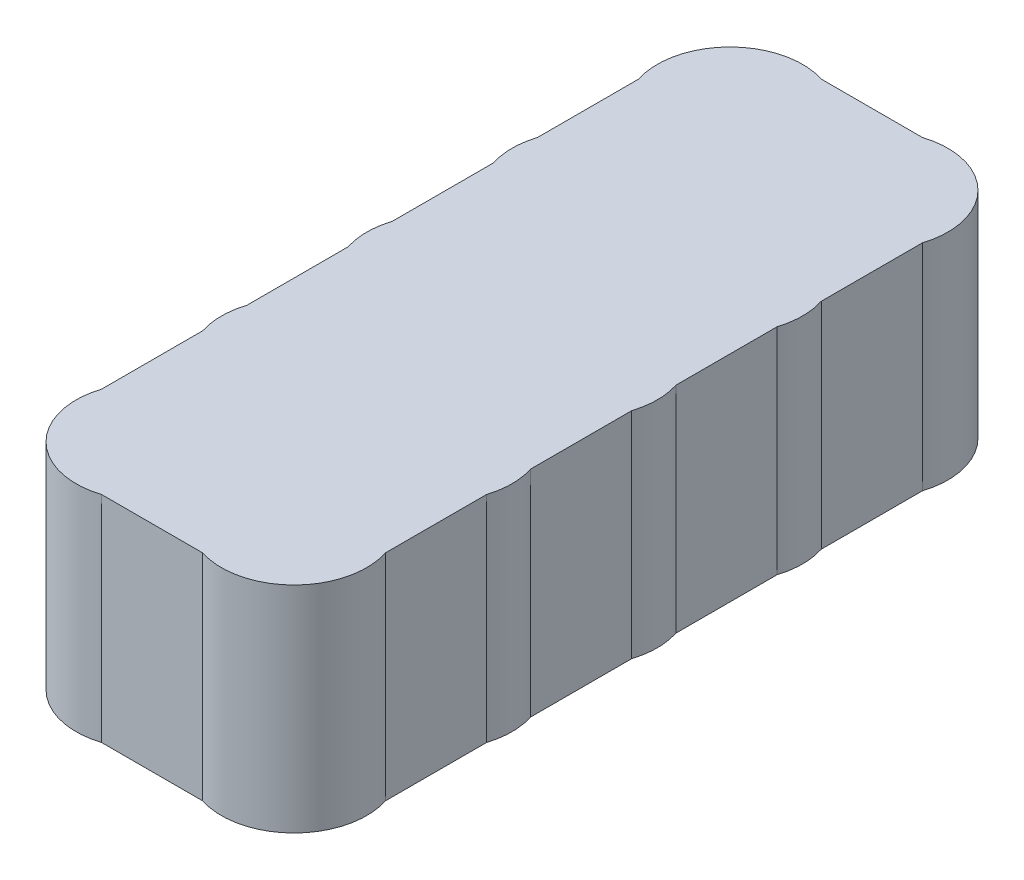
ISO-10303-21;
HEADER;
FILE_DESCRIPTION(('STEP AP214'),'2;1');
FILE_NAME('part.step','',(''),(''),'','','');
FILE_SCHEMA(('AUTOMOTIVE_DESIGN { 1 0 10303 214 1 1 1 1 }'));
ENDSEC;
DATA;
#1=APPLICATION_CONTEXT('core data for automotive mechanical design processes');
#2=APPLICATION_PROTOCOL_DEFINITION('international standard','automotive_design',2000,#1);
#3=PRODUCT_CONTEXT('',#1,'mechanical');
#4=PRODUCT('Part','Part','',(#3));
#5=PRODUCT_RELATED_PRODUCT_CATEGORY('part','',(#4));
#6=PRODUCT_DEFINITION_FORMATION('','',#4);
#7=PRODUCT_DEFINITION_CONTEXT('part definition',#1,'design');
#8=PRODUCT_DEFINITION('design','',#6,#7);
#9=PRODUCT_DEFINITION_SHAPE('','',#8);
#10=(LENGTH_UNIT() NAMED_UNIT(*) SI_UNIT(.MILLI.,.METRE.));
#11=(NAMED_UNIT(*) PLANE_ANGLE_UNIT() SI_UNIT($,.RADIAN.));
#12=(NAMED_UNIT(*) SI_UNIT($,.STERADIAN.) SOLID_ANGLE_UNIT());
#13=UNCERTAINTY_MEASURE_WITH_UNIT(LENGTH_MEASURE(1.E-05),#10,'distance_accuracy_value','');
#14=(GEOMETRIC_REPRESENTATION_CONTEXT(3) GLOBAL_UNCERTAINTY_ASSIGNED_CONTEXT((#13)) GLOBAL_UNIT_ASSIGNED_CONTEXT((#10,
#11,#12)) REPRESENTATION_CONTEXT('',''));
#15=CARTESIAN_POINT('',(0.,0.,0.));
#16=DIRECTION('',(0.,0.,1.));
#17=DIRECTION('',(1.,0.,0.));
#18=AXIS2_PLACEMENT_3D('',#15,#16,#17);
#19=CARTESIAN_POINT('',(22.9999999999998,34.,-46.));
#20=DIRECTION('',(0.,-1.,0.));
#21=DIRECTION('',(0.,0.,-1.));
#22=AXIS2_PLACEMENT_3D('',#19,#20,#21);
#23=CYLINDRICAL_SURFACE('',#22,11.5);
#24=CARTESIAN_POINT('',(22.9999999999998,34.,-46.));
#25=DIRECTION('',(0.,1.,0.));
#26=DIRECTION('',(0.,0.,1.));
#27=AXIS2_PLACEMENT_3D('',#24,#25,#26);
#28=CIRCLE('',#27,11.5);
#29=CARTESIAN_POINT('',(33.954451150103,34.,-42.4999999999995));
#30=VERTEX_POINT('',#29);
#31=CARTESIAN_POINT('',(33.954451150103,34.,-49.5000000000005));
#32=VERTEX_POINT('',#31);
#33=EDGE_CURVE('E332',#30,#32,#28,.T.);
#34=ORIENTED_EDGE('',*,*,#33,.F.);
#35=DIRECTION('',(0.,-1.,0.));
#36=VECTOR('',#35,1.);
#37=CARTESIAN_POINT('',(33.954451150103,34.,-42.4999999999995));
#38=LINE('',#37,#36);
#39=CARTESIAN_POINT('',(33.954451150103,0.,-42.4999999999995));
#40=VERTEX_POINT('',#39);
#41=EDGE_CURVE('E328',#30,#40,#38,.T.);
#42=ORIENTED_EDGE('',*,*,#41,.T.);
#43=CARTESIAN_POINT('',(22.9999999999998,0.,-46.));
#44=DIRECTION('',(0.,1.,0.));
#45=DIRECTION('',(0.,0.,1.));
#46=AXIS2_PLACEMENT_3D('',#43,#44,#45);
#47=CIRCLE('',#46,11.5);
#48=CARTESIAN_POINT('',(33.954451150103,0.,-49.5000000000005));
#49=VERTEX_POINT('',#48);
#50=EDGE_CURVE('E331',#40,#49,#47,.T.);
#51=ORIENTED_EDGE('',*,*,#50,.T.);
#52=DIRECTION('',(0.,-1.,0.));
#53=VECTOR('',#52,1.);
#54=CARTESIAN_POINT('',(33.954451150103,34.,-49.5000000000005));
#55=LINE('',#54,#53);
#56=EDGE_CURVE('E325',#49,#32,#55,.F.);
#57=ORIENTED_EDGE('',*,*,#56,.T.);
#58=EDGE_LOOP('',(#34,#42,#51,#57));
#59=FACE_BOUND('',#58,.T.);
#60=ADVANCED_FACE('F45',(#59),#23,.T.);
#61=CARTESIAN_POINT('',(22.9999999999998,34.,-69.));
#62=DIRECTION('',(0.,-1.,0.));
#63=DIRECTION('',(0.,0.,-1.));
#64=AXIS2_PLACEMENT_3D('',#61,#62,#63);
#65=CYLINDRICAL_SURFACE('',#64,11.5);
#66=CARTESIAN_POINT('',(22.9999999999998,34.,-69.));
#67=DIRECTION('',(0.,1.,0.));
#68=DIRECTION('',(0.,0.,1.));
#69=AXIS2_PLACEMENT_3D('',#66,#67,#68);
#70=CIRCLE('',#69,11.5);
#71=CARTESIAN_POINT('',(33.954451150103,34.,-65.4999999999998));
#72=VERTEX_POINT('',#71);
#73=CARTESIAN_POINT('',(33.954451150103,34.,-72.5000000000003));
#74=VERTEX_POINT('',#73);
#75=EDGE_CURVE('E336',#72,#74,#70,.T.);
#76=ORIENTED_EDGE('',*,*,#75,.F.);
#77=DIRECTION('',(0.,-1.,0.));
#78=VECTOR('',#77,1.);
#79=CARTESIAN_POINT('',(33.954451150103,34.,-65.4999999999998));
#80=LINE('',#79,#78);
#81=CARTESIAN_POINT('',(33.954451150103,0.,-65.4999999999998));
#82=VERTEX_POINT('',#81);
#83=EDGE_CURVE('E321',#72,#82,#80,.T.);
#84=ORIENTED_EDGE('',*,*,#83,.T.);
#85=CARTESIAN_POINT('',(22.9999999999998,0.,-69.));
#86=DIRECTION('',(0.,1.,0.));
#87=DIRECTION('',(0.,0.,1.));
#88=AXIS2_PLACEMENT_3D('',#85,#86,#87);
#89=CIRCLE('',#88,11.5);
#90=CARTESIAN_POINT('',(33.954451150103,0.,-72.5000000000003));
#91=VERTEX_POINT('',#90);
#92=EDGE_CURVE('E358',#82,#91,#89,.T.);
#93=ORIENTED_EDGE('',*,*,#92,.T.);
#94=DIRECTION('',(0.,-1.,0.));
#95=VECTOR('',#94,1.);
#96=CARTESIAN_POINT('',(33.954451150103,34.,-72.5000000000003));
#97=LINE('',#96,#95);
#98=EDGE_CURVE('E318',#91,#74,#97,.F.);
#99=ORIENTED_EDGE('',*,*,#98,.T.);
#100=EDGE_LOOP('',(#76,#84,#93,#99));
#101=FACE_BOUND('',#100,.T.);
#102=ADVANCED_FACE('F442',(#101),#65,.T.);
#103=CARTESIAN_POINT('',(22.9999999999997,34.,-92.));
#104=DIRECTION('',(0.,-1.,0.));
#105=DIRECTION('',(0.,0.,-1.));
#106=AXIS2_PLACEMENT_3D('',#103,#104,#105);
#107=CYLINDRICAL_SURFACE('',#106,11.5);
#108=CARTESIAN_POINT('',(22.9999999999997,0.,-92.));
#109=DIRECTION('',(0.,1.,0.));
#110=DIRECTION('',(0.,0.,1.));
#111=AXIS2_PLACEMENT_3D('',#108,#109,#110);
#112=CIRCLE('',#111,11.5);
#113=CARTESIAN_POINT('',(33.954451150103,0.,-88.5));
#114=VERTEX_POINT('',#113);
#115=CARTESIAN_POINT('',(19.4999999999997,0.,-102.954451150103));
#116=VERTEX_POINT('',#115);
#117=EDGE_CURVE('E361',#114,#116,#112,.T.);
#118=ORIENTED_EDGE('',*,*,#117,.T.);
#119=DIRECTION('',(0.,1.,0.));
#120=VECTOR('',#119,1.);
#121=CARTESIAN_POINT('',(19.4999999999997,-122.442017008246,-102.954451150103));
#122=LINE('',#121,#120);
#123=CARTESIAN_POINT('',(19.4999999999997,34.,-102.954451150103));
#124=VERTEX_POINT('',#123);
#125=EDGE_CURVE('E265',#116,#124,#122,.T.);
#126=ORIENTED_EDGE('',*,*,#125,.T.);
#127=CARTESIAN_POINT('',(22.9999999999997,34.,-92.));
#128=DIRECTION('',(0.,1.,0.));
#129=DIRECTION('',(0.,0.,1.));
#130=AXIS2_PLACEMENT_3D('',#127,#128,#129);
#131=CIRCLE('',#130,11.5);
#132=CARTESIAN_POINT('',(33.954451150103,34.,-88.5));
#133=VERTEX_POINT('',#132);
#134=EDGE_CURVE('E294',#133,#124,#131,.T.);
#135=ORIENTED_EDGE('',*,*,#134,.F.);
#136=DIRECTION('',(0.,1.,0.));
#137=VECTOR('',#136,1.);
#138=CARTESIAN_POINT('',(33.954451150103,-122.442017008246,-88.5));
#139=LINE('',#138,#137);
#140=EDGE_CURVE('E268',#114,#133,#139,.T.);
#141=ORIENTED_EDGE('',*,*,#140,.F.);
#142=EDGE_LOOP('',(#118,#126,#135,#141));
#143=FACE_BOUND('',#142,.T.);
#144=ADVANCED_FACE('F447',(#143),#107,.T.);
#145=CARTESIAN_POINT('',(-3.15582907897491E-13,34.,-92.));
#146=DIRECTION('',(0.,-1.,0.));
#147=DIRECTION('',(0.,0.,-1.));
#148=AXIS2_PLACEMENT_3D('',#145,#146,#147);
#149=CYLINDRICAL_SURFACE('',#148,11.5);
#150=CARTESIAN_POINT('',(-3.15582907897491E-13,34.,-92.));
#151=DIRECTION('',(0.,1.,0.));
#152=DIRECTION('',(0.,0.,1.));
#153=AXIS2_PLACEMENT_3D('',#150,#151,#152);
#154=CIRCLE('',#153,11.5);
#155=CARTESIAN_POINT('',(3.49999999999969,34.,-102.954451150103));
#156=VERTEX_POINT('',#155);
#157=CARTESIAN_POINT('',(-10.9544511501036,34.,-88.4999999999999));
#158=VERTEX_POINT('',#157);
#159=EDGE_CURVE('E282',#156,#158,#154,.T.);
#160=ORIENTED_EDGE('',*,*,#159,.F.);
#161=DIRECTION('',(0.,1.,0.));
#162=VECTOR('',#161,1.);
#163=CARTESIAN_POINT('',(3.4999999999997,-122.442017008246,-102.954451150103));
#164=LINE('',#163,#162);
#165=CARTESIAN_POINT('',(3.4999999999997,0.,-102.954451150103));
#166=VERTEX_POINT('',#165);
#167=EDGE_CURVE('E261',#166,#156,#164,.T.);
#168=ORIENTED_EDGE('',*,*,#167,.F.);
#169=CARTESIAN_POINT('',(-3.15582907897491E-13,0.,-92.));
#170=DIRECTION('',(0.,1.,0.));
#171=DIRECTION('',(0.,0.,1.));
#172=AXIS2_PLACEMENT_3D('',#169,#170,#171);
#173=CIRCLE('',#172,11.5);
#174=CARTESIAN_POINT('',(-10.9544511501036,0.,-88.4999999999999));
#175=VERTEX_POINT('',#174);
#176=EDGE_CURVE('E283',#166,#175,#173,.T.);
#177=ORIENTED_EDGE('',*,*,#176,.T.);
#178=DIRECTION('',(0.,1.,0.));
#179=VECTOR('',#178,1.);
#180=CARTESIAN_POINT('',(-10.9544511501036,-122.442017008246,-88.4999999999998));
#181=LINE('',#180,#179);
#182=EDGE_CURVE('E205',#175,#158,#181,.T.);
#183=ORIENTED_EDGE('',*,*,#182,.T.);
#184=EDGE_LOOP('',(#160,#168,#177,#183));
#185=FACE_BOUND('',#184,.T.);
#186=ADVANCED_FACE('F280',(#185),#149,.T.);
#187=CARTESIAN_POINT('',(-2.36687180923118E-13,34.,-69.));
#188=DIRECTION('',(0.,-1.,0.));
#189=DIRECTION('',(0.,0.,-1.));
#190=AXIS2_PLACEMENT_3D('',#187,#188,#189);
#191=CYLINDRICAL_SURFACE('',#190,11.5);
#192=CARTESIAN_POINT('',(-2.36687180923118E-13,34.,-69.));
#193=DIRECTION('',(0.,1.,0.));
#194=DIRECTION('',(0.,0.,1.));
#195=AXIS2_PLACEMENT_3D('',#192,#193,#194);
#196=CIRCLE('',#195,11.5);
#197=CARTESIAN_POINT('',(-10.9544511501036,34.,-72.4999999999998));
#198=VERTEX_POINT('',#197);
#199=CARTESIAN_POINT('',(-10.9544511501036,34.,-65.5000000000002));
#200=VERTEX_POINT('',#199);
#201=EDGE_CURVE('E293',#198,#200,#196,.T.);
#202=ORIENTED_EDGE('',*,*,#201,.F.);
#203=DIRECTION('',(0.,-1.,0.));
#204=VECTOR('',#203,1.);
#205=CARTESIAN_POINT('',(-10.9544511501036,34.,-72.4999999999998));
#206=LINE('',#205,#204);
#207=CARTESIAN_POINT('',(-10.9544511501036,0.,-72.4999999999998));
#208=VERTEX_POINT('',#207);
#209=EDGE_CURVE('E299',#198,#208,#206,.T.);
#210=ORIENTED_EDGE('',*,*,#209,.T.);
#211=CARTESIAN_POINT('',(-2.36687180923118E-13,0.,-69.));
#212=DIRECTION('',(0.,1.,0.));
#213=DIRECTION('',(0.,0.,1.));
#214=AXIS2_PLACEMENT_3D('',#211,#212,#213);
#215=CIRCLE('',#214,11.5);
#216=CARTESIAN_POINT('',(-10.9544511501036,0.,-65.5000000000002));
#217=VERTEX_POINT('',#216);
#218=EDGE_CURVE('E366',#208,#217,#215,.T.);
#219=ORIENTED_EDGE('',*,*,#218,.T.);
#220=DIRECTION('',(0.,-1.,0.));
#221=VECTOR('',#220,1.);
#222=CARTESIAN_POINT('',(-10.9544511501036,34.,-65.5000000000002));
#223=LINE('',#222,#221);
#224=EDGE_CURVE('E302',#217,#200,#223,.F.);
#225=ORIENTED_EDGE('',*,*,#224,.T.);
#226=EDGE_LOOP('',(#202,#210,#219,#225));
#227=FACE_BOUND('',#226,.T.);
#228=ADVANCED_FACE('F433',(#227),#191,.T.);
#229=CARTESIAN_POINT('',(-1.57791453948745E-13,34.,-46.));
#230=DIRECTION('',(0.,-1.,0.));
#231=DIRECTION('',(0.,0.,-1.));
#232=AXIS2_PLACEMENT_3D('',#229,#230,#231);
#233=CYLINDRICAL_SURFACE('',#232,11.5);
#234=CARTESIAN_POINT('',(-1.57791453948745E-13,34.,-46.));
#235=DIRECTION('',(0.,1.,0.));
#236=DIRECTION('',(0.,0.,1.));
#237=AXIS2_PLACEMENT_3D('',#234,#235,#236);
#238=CIRCLE('',#237,11.5);
#239=CARTESIAN_POINT('',(-10.9544511501036,34.,-49.4999999999996));
#240=VERTEX_POINT('',#239);
#241=CARTESIAN_POINT('',(-10.9544511501036,34.,-42.5000000000004));
#242=VERTEX_POINT('',#241);
#243=EDGE_CURVE('E344',#240,#242,#238,.T.);
#244=ORIENTED_EDGE('',*,*,#243,.F.);
#245=DIRECTION('',(0.,-1.,0.));
#246=VECTOR('',#245,1.);
#247=CARTESIAN_POINT('',(-10.9544511501036,34.,-49.4999999999996));
#248=LINE('',#247,#246);
#249=CARTESIAN_POINT('',(-10.9544511501036,0.,-49.4999999999996));
#250=VERTEX_POINT('',#249);
#251=EDGE_CURVE('E308',#240,#250,#248,.T.);
#252=ORIENTED_EDGE('',*,*,#251,.T.);
#253=CARTESIAN_POINT('',(-1.57791453948745E-13,0.,-46.));
#254=DIRECTION('',(0.,1.,0.));
#255=DIRECTION('',(0.,0.,1.));
#256=AXIS2_PLACEMENT_3D('',#253,#254,#255);
#257=CIRCLE('',#256,11.5);
#258=CARTESIAN_POINT('',(-10.9544511501036,0.,-42.5000000000004));
#259=VERTEX_POINT('',#258);
#260=EDGE_CURVE('E369',#250,#259,#257,.T.);
#261=ORIENTED_EDGE('',*,*,#260,.T.);
#262=DIRECTION('',(0.,-1.,0.));
#263=VECTOR('',#262,1.);
#264=CARTESIAN_POINT('',(-10.9544511501036,34.,-42.5000000000004));
#265=LINE('',#264,#263);
#266=EDGE_CURVE('E418',#259,#242,#265,.F.);
#267=ORIENTED_EDGE('',*,*,#266,.T.);
#268=EDGE_LOOP('',(#244,#252,#261,#267));
#269=FACE_BOUND('',#268,.T.);
#270=ADVANCED_FACE('F431',(#269),#233,.T.);
#271=CARTESIAN_POINT('',(0.,34.,-23.));
#272=DIRECTION('',(0.,-1.,0.));
#273=DIRECTION('',(0.,0.,-1.));
#274=AXIS2_PLACEMENT_3D('',#271,#272,#273);
#275=CYLINDRICAL_SURFACE('',#274,11.5);
#276=CARTESIAN_POINT('',(0.,34.,-23.));
#277=DIRECTION('',(0.,1.,0.));
#278=DIRECTION('',(0.,0.,1.));
#279=AXIS2_PLACEMENT_3D('',#276,#277,#278);
#280=CIRCLE('',#279,11.5);
#281=CARTESIAN_POINT('',(-10.9544511501036,34.,-26.4999999999994));
#282=VERTEX_POINT('',#281);
#283=CARTESIAN_POINT('',(-10.9544511501036,34.,-19.5000000000006));
#284=VERTEX_POINT('',#283);
#285=EDGE_CURVE('E348',#282,#284,#280,.T.);
#286=ORIENTED_EDGE('',*,*,#285,.F.);
#287=DIRECTION('',(0.,-1.,0.));
#288=VECTOR('',#287,1.);
#289=CARTESIAN_POINT('',(-10.9544511501036,34.,-26.4999999999994));
#290=LINE('',#289,#288);
#291=CARTESIAN_POINT('',(-10.9544511501036,0.,-26.4999999999994));
#292=VERTEX_POINT('',#291);
#293=EDGE_CURVE('E216',#282,#292,#290,.T.);
#294=ORIENTED_EDGE('',*,*,#293,.T.);
#295=CARTESIAN_POINT('',(0.,0.,-23.));
#296=DIRECTION('',(0.,1.,0.));
#297=DIRECTION('',(0.,0.,1.));
#298=AXIS2_PLACEMENT_3D('',#295,#296,#297);
#299=CIRCLE('',#298,11.5);
#300=CARTESIAN_POINT('',(-10.9544511501036,0.,-19.5000000000006));
#301=VERTEX_POINT('',#300);
#302=EDGE_CURVE('E193',#292,#301,#299,.T.);
#303=ORIENTED_EDGE('',*,*,#302,.T.);
#304=DIRECTION('',(0.,-1.,0.));
#305=VECTOR('',#304,1.);
#306=CARTESIAN_POINT('',(-10.9544511501036,34.,-19.5000000000006));
#307=LINE('',#306,#305);
#308=EDGE_CURVE('E209',#301,#284,#307,.F.);
#309=ORIENTED_EDGE('',*,*,#308,.T.);
#310=EDGE_LOOP('',(#286,#294,#303,#309));
#311=FACE_BOUND('',#310,.T.);
#312=ADVANCED_FACE('F427',(#311),#275,.T.);
#313=CARTESIAN_POINT('',(0.,34.,0.));
#314=DIRECTION('',(0.,-1.,0.));
#315=DIRECTION('',(0.,0.,-1.));
#316=AXIS2_PLACEMENT_3D('',#313,#314,#315);
#317=CYLINDRICAL_SURFACE('',#316,11.5);
#318=CARTESIAN_POINT('',(0.,0.,0.));
#319=DIRECTION('',(0.,1.,0.));
#320=DIRECTION('',(0.,0.,1.));
#321=AXIS2_PLACEMENT_3D('',#318,#319,#320);
#322=CIRCLE('',#321,11.5);
#323=CARTESIAN_POINT('',(-10.9544511501036,0.,-3.49999999999913));
#324=VERTEX_POINT('',#323);
#325=CARTESIAN_POINT('',(3.49999999999999,0.,10.9544511501033));
#326=VERTEX_POINT('',#325);
#327=EDGE_CURVE('E181',#324,#326,#322,.T.);
#328=ORIENTED_EDGE('',*,*,#327,.T.);
#329=DIRECTION('',(0.,1.,0.));
#330=VECTOR('',#329,1.);
#331=CARTESIAN_POINT('',(3.5,-122.442017008246,10.9544511501033));
#332=LINE('',#331,#330);
#333=CARTESIAN_POINT('',(3.49999999999999,34.,10.9544511501033));
#334=VERTEX_POINT('',#333);
#335=EDGE_CURVE('E204',#326,#334,#332,.T.);
#336=ORIENTED_EDGE('',*,*,#335,.T.);
#337=CARTESIAN_POINT('',(0.,34.,0.));
#338=DIRECTION('',(0.,1.,0.));
#339=DIRECTION('',(0.,0.,1.));
#340=AXIS2_PLACEMENT_3D('',#337,#338,#339);
#341=CIRCLE('',#340,11.5);
#342=CARTESIAN_POINT('',(-10.9544511501036,34.,-3.49999999999913));
#343=VERTEX_POINT('',#342);
#344=EDGE_CURVE('E199',#343,#334,#341,.T.);
#345=ORIENTED_EDGE('',*,*,#344,.F.);
#346=DIRECTION('',(0.,1.,0.));
#347=VECTOR('',#346,1.);
#348=CARTESIAN_POINT('',(-10.9544511501036,-122.442017008246,-3.49999999999913));
#349=LINE('',#348,#347);
#350=EDGE_CURVE('E196',#324,#343,#349,.T.);
#351=ORIENTED_EDGE('',*,*,#350,.F.);
#352=EDGE_LOOP('',(#328,#336,#345,#351));
#353=FACE_BOUND('',#352,.T.);
#354=ADVANCED_FACE('F197',(#353),#317,.T.);
#355=CARTESIAN_POINT('',(23.,34.,0.));
#356=DIRECTION('',(0.,-1.,0.));
#357=DIRECTION('',(0.,0.,-1.));
#358=AXIS2_PLACEMENT_3D('',#355,#356,#357);
#359=CYLINDRICAL_SURFACE('',#358,11.5);
#360=CARTESIAN_POINT('',(23.,0.,0.));
#361=DIRECTION('',(0.,1.,0.));
#362=DIRECTION('',(0.,0.,1.));
#363=AXIS2_PLACEMENT_3D('',#360,#361,#362);
#364=CIRCLE('',#363,11.5);
#365=CARTESIAN_POINT('',(19.5,0.,10.9544511501033));
#366=VERTEX_POINT('',#365);
#367=CARTESIAN_POINT('',(33.954451150103,0.,-3.50000000000099));
#368=VERTEX_POINT('',#367);
#369=EDGE_CURVE('E192',#366,#368,#364,.T.);
#370=ORIENTED_EDGE('',*,*,#369,.T.);
#371=DIRECTION('',(0.,-1.,0.));
#372=VECTOR('',#371,1.);
#373=CARTESIAN_POINT('',(33.954451150103,34.,-3.50000000000097));
#374=LINE('',#373,#372);
#375=CARTESIAN_POINT('',(33.954451150103,34.,-3.50000000000099));
#376=VERTEX_POINT('',#375);
#377=EDGE_CURVE('E314',#368,#376,#374,.F.);
#378=ORIENTED_EDGE('',*,*,#377,.T.);
#379=CARTESIAN_POINT('',(23.,34.,0.));
#380=DIRECTION('',(0.,1.,0.));
#381=DIRECTION('',(0.,0.,1.));
#382=AXIS2_PLACEMENT_3D('',#379,#380,#381);
#383=CIRCLE('',#382,11.5);
#384=CARTESIAN_POINT('',(19.5,34.,10.9544511501033));
#385=VERTEX_POINT('',#384);
#386=EDGE_CURVE('E54',#385,#376,#383,.T.);
#387=ORIENTED_EDGE('',*,*,#386,.F.);
#388=DIRECTION('',(0.,1.,0.));
#389=VECTOR('',#388,1.);
#390=CARTESIAN_POINT('',(19.5,-122.442017008246,10.9544511501033));
#391=LINE('',#390,#389);
#392=EDGE_CURVE('E272',#366,#385,#391,.T.);
#393=ORIENTED_EDGE('',*,*,#392,.F.);
#394=EDGE_LOOP('',(#370,#378,#387,#393));
#395=FACE_BOUND('',#394,.T.);
#396=ADVANCED_FACE('F398',(#395),#359,.T.);
#397=CARTESIAN_POINT('',(22.9999999999999,34.,-23.));
#398=DIRECTION('',(0.,-1.,0.));
#399=DIRECTION('',(0.,0.,-1.));
#400=AXIS2_PLACEMENT_3D('',#397,#398,#399);
#401=CYLINDRICAL_SURFACE('',#400,11.5);
#402=CARTESIAN_POINT('',(22.9999999999999,34.,-23.));
#403=DIRECTION('',(0.,1.,0.));
#404=DIRECTION('',(0.,0.,1.));
#405=AXIS2_PLACEMENT_3D('',#402,#403,#404);
#406=CIRCLE('',#405,11.5);
#407=CARTESIAN_POINT('',(33.954451150103,34.,-19.4999999999992));
#408=VERTEX_POINT('',#407);
#409=CARTESIAN_POINT('',(33.954451150103,34.,-26.5000000000008));
#410=VERTEX_POINT('',#409);
#411=EDGE_CURVE('E11',#408,#410,#406,.T.);
#412=ORIENTED_EDGE('',*,*,#411,.F.);
#413=DIRECTION('',(0.,-1.,0.));
#414=VECTOR('',#413,1.);
#415=CARTESIAN_POINT('',(33.954451150103,34.,-19.4999999999993));
#416=LINE('',#415,#414);
#417=CARTESIAN_POINT('',(33.954451150103,0.,-19.4999999999992));
#418=VERTEX_POINT('',#417);
#419=EDGE_CURVE('E306',#408,#418,#416,.T.);
#420=ORIENTED_EDGE('',*,*,#419,.T.);
#421=CARTESIAN_POINT('',(22.9999999999999,0.,-23.));
#422=DIRECTION('',(0.,1.,0.));
#423=DIRECTION('',(0.,0.,1.));
#424=AXIS2_PLACEMENT_3D('',#421,#422,#423);
#425=CIRCLE('',#424,11.5);
#426=CARTESIAN_POINT('',(33.954451150103,0.,-26.5000000000008));
#427=VERTEX_POINT('',#426);
#428=EDGE_CURVE('E48',#418,#427,#425,.T.);
#429=ORIENTED_EDGE('',*,*,#428,.T.);
#430=DIRECTION('',(0.,-1.,0.));
#431=VECTOR('',#430,1.);
#432=CARTESIAN_POINT('',(33.954451150103,34.,-26.5000000000007));
#433=LINE('',#432,#431);
#434=EDGE_CURVE('E62',#427,#410,#433,.F.);
#435=ORIENTED_EDGE('',*,*,#434,.T.);
#436=EDGE_LOOP('',(#412,#420,#429,#435));
#437=FACE_BOUND('',#436,.T.);
#438=ADVANCED_FACE('F378',(#437),#401,.T.);
#439=CARTESIAN_POINT('',(22.9999999999998,34.,-57.5));
#440=DIRECTION('',(0.,1.,0.));
#441=DIRECTION('',(0.,0.,1.));
#442=AXIS2_PLACEMENT_3D('',#439,#440,#441);
#443=PLANE('',#442);
#444=DIRECTION('',(0.,0.,-1.));
#445=VECTOR('',#444,1.);
#446=CARTESIAN_POINT('',(33.954451150103,34.,-88.5));
#447=LINE('',#446,#445);
#448=EDGE_CURVE('E388',#410,#30,#447,.T.);
#449=ORIENTED_EDGE('',*,*,#448,.T.);
#450=ORIENTED_EDGE('',*,*,#33,.T.);
#451=EDGE_CURVE('E255',#32,#72,#447,.T.);
#452=ORIENTED_EDGE('',*,*,#451,.T.);
#453=ORIENTED_EDGE('',*,*,#75,.T.);
#454=EDGE_CURVE('E251',#74,#133,#447,.T.);
#455=ORIENTED_EDGE('',*,*,#454,.T.);
#456=ORIENTED_EDGE('',*,*,#134,.T.);
#457=DIRECTION('',(-1.,0.,0.));
#458=VECTOR('',#457,1.);
#459=CARTESIAN_POINT('',(3.4999999999997,34.,-102.954451150103));
#460=LINE('',#459,#458);
#461=EDGE_CURVE('E257',#124,#156,#460,.T.);
#462=ORIENTED_EDGE('',*,*,#461,.T.);
#463=ORIENTED_EDGE('',*,*,#159,.T.);
#464=DIRECTION('',(0.,0.,1.));
#465=VECTOR('',#464,1.);
#466=CARTESIAN_POINT('',(-10.9544511501036,34.,-72.4999999999998));
#467=LINE('',#466,#465);
#468=EDGE_CURVE('E241',#158,#198,#467,.T.);
#469=ORIENTED_EDGE('',*,*,#468,.T.);
#470=ORIENTED_EDGE('',*,*,#201,.T.);
#471=EDGE_CURVE('E246',#200,#240,#467,.T.);
#472=ORIENTED_EDGE('',*,*,#471,.T.);
#473=ORIENTED_EDGE('',*,*,#243,.T.);
#474=EDGE_CURVE('E404',#242,#282,#467,.T.);
#475=ORIENTED_EDGE('',*,*,#474,.T.);
#476=ORIENTED_EDGE('',*,*,#285,.T.);
#477=EDGE_CURVE('E247',#284,#343,#467,.T.);
#478=ORIENTED_EDGE('',*,*,#477,.T.);
#479=ORIENTED_EDGE('',*,*,#344,.T.);
#480=DIRECTION('',(1.,0.,0.));
#481=VECTOR('',#480,1.);
#482=CARTESIAN_POINT('',(3.5,34.,10.9544511501033));
#483=LINE('',#482,#481);
#484=EDGE_CURVE('E245',#334,#385,#483,.T.);
#485=ORIENTED_EDGE('',*,*,#484,.T.);
#486=ORIENTED_EDGE('',*,*,#386,.T.);
#487=EDGE_CURVE('E256',#376,#408,#447,.T.);
#488=ORIENTED_EDGE('',*,*,#487,.T.);
#489=ORIENTED_EDGE('',*,*,#411,.T.);
#490=EDGE_LOOP('',(#449,#450,#452,#453,#455,#456,#462,#463,#469,#470,#472,#473,#475,#476,#478,
#479,#485,#486,#488,#489));
#491=FACE_BOUND('',#490,.T.);
#492=ADVANCED_FACE('F288',(#491),#443,.T.);
#493=CARTESIAN_POINT('',(22.9999999999998,0.,-57.5));
#494=DIRECTION('',(0.,1.,0.));
#495=DIRECTION('',(0.,0.,1.));
#496=AXIS2_PLACEMENT_3D('',#493,#494,#495);
#497=PLANE('',#496);
#498=ORIENTED_EDGE('',*,*,#50,.F.);
#499=DIRECTION('',(0.,0.,1.));
#500=VECTOR('',#499,1.);
#501=CARTESIAN_POINT('',(33.954451150103,0.,-88.5));
#502=LINE('',#501,#500);
#503=EDGE_CURVE('E387',#40,#427,#502,.T.);
#504=ORIENTED_EDGE('',*,*,#503,.T.);
#505=ORIENTED_EDGE('',*,*,#428,.F.);
#506=EDGE_CURVE('E238',#418,#368,#502,.T.);
#507=ORIENTED_EDGE('',*,*,#506,.T.);
#508=ORIENTED_EDGE('',*,*,#369,.F.);
#509=DIRECTION('',(-1.,0.,0.));
#510=VECTOR('',#509,1.);
#511=CARTESIAN_POINT('',(3.5,0.,10.9544511501033));
#512=LINE('',#511,#510);
#513=EDGE_CURVE('E188',#366,#326,#512,.T.);
#514=ORIENTED_EDGE('',*,*,#513,.T.);
#515=ORIENTED_EDGE('',*,*,#327,.F.);
#516=DIRECTION('',(0.,0.,-1.));
#517=VECTOR('',#516,1.);
#518=CARTESIAN_POINT('',(-10.9544511501036,0.,-72.4999999999998));
#519=LINE('',#518,#517);
#520=EDGE_CURVE('E186',#324,#301,#519,.T.);
#521=ORIENTED_EDGE('',*,*,#520,.T.);
#522=ORIENTED_EDGE('',*,*,#302,.F.);
#523=EDGE_CURVE('E211',#292,#259,#519,.T.);
#524=ORIENTED_EDGE('',*,*,#523,.T.);
#525=ORIENTED_EDGE('',*,*,#260,.F.);
#526=EDGE_CURVE('E219',#250,#217,#519,.T.);
#527=ORIENTED_EDGE('',*,*,#526,.T.);
#528=ORIENTED_EDGE('',*,*,#218,.F.);
#529=EDGE_CURVE('E213',#208,#175,#519,.T.);
#530=ORIENTED_EDGE('',*,*,#529,.T.);
#531=ORIENTED_EDGE('',*,*,#176,.F.);
#532=DIRECTION('',(1.,0.,0.));
#533=VECTOR('',#532,1.);
#534=CARTESIAN_POINT('',(3.4999999999997,0.,-102.954451150103));
#535=LINE('',#534,#533);
#536=EDGE_CURVE('E223',#166,#116,#535,.T.);
#537=ORIENTED_EDGE('',*,*,#536,.T.);
#538=ORIENTED_EDGE('',*,*,#117,.F.);
#539=EDGE_CURVE('E230',#114,#91,#502,.T.);
#540=ORIENTED_EDGE('',*,*,#539,.T.);
#541=ORIENTED_EDGE('',*,*,#92,.F.);
#542=EDGE_CURVE('E236',#82,#49,#502,.T.);
#543=ORIENTED_EDGE('',*,*,#542,.T.);
#544=EDGE_LOOP('',(#498,#504,#505,#507,#508,#514,#515,#521,#522,#524,#525,#527,#528,#530,#531,
#537,#538,#540,#541,#543));
#545=FACE_BOUND('',#544,.T.);
#546=ADVANCED_FACE('F184',(#545),#497,.F.);
#547=CARTESIAN_POINT('',(33.954451150103,-122.442017008246,-88.5));
#548=DIRECTION('',(1.,0.,0.));
#549=DIRECTION('',(0.,0.,-1.));
#550=AXIS2_PLACEMENT_3D('',#547,#548,#549);
#551=PLANE('',#550);
#552=ORIENTED_EDGE('',*,*,#377,.F.);
#553=ORIENTED_EDGE('',*,*,#506,.F.);
#554=ORIENTED_EDGE('',*,*,#419,.F.);
#555=ORIENTED_EDGE('',*,*,#487,.F.);
#556=EDGE_LOOP('',(#552,#553,#554,#555));
#557=FACE_BOUND('',#556,.T.);
#558=ADVANCED_FACE('F395',(#557),#551,.T.);
#559=ORIENTED_EDGE('',*,*,#41,.F.);
#560=ORIENTED_EDGE('',*,*,#448,.F.);
#561=ORIENTED_EDGE('',*,*,#434,.F.);
#562=ORIENTED_EDGE('',*,*,#503,.F.);
#563=EDGE_LOOP('',(#559,#560,#561,#562));
#564=FACE_BOUND('',#563,.T.);
#565=ADVANCED_FACE('F386',(#564),#551,.T.);
#566=CARTESIAN_POINT('',(3.5,-122.442017008246,10.9544511501033));
#567=DIRECTION('',(0.,0.,1.));
#568=DIRECTION('',(1.,0.,0.));
#569=AXIS2_PLACEMENT_3D('',#566,#567,#568);
#570=PLANE('',#569);
#571=ORIENTED_EDGE('',*,*,#513,.F.);
#572=ORIENTED_EDGE('',*,*,#392,.T.);
#573=ORIENTED_EDGE('',*,*,#484,.F.);
#574=ORIENTED_EDGE('',*,*,#335,.F.);
#575=EDGE_LOOP('',(#571,#572,#573,#574));
#576=FACE_BOUND('',#575,.T.);
#577=ADVANCED_FACE('F401',(#576),#570,.T.);
#578=CARTESIAN_POINT('',(-10.9544511501036,-122.442017008246,-72.4999999999998));
#579=DIRECTION('',(-1.,0.,0.));
#580=DIRECTION('',(0.,0.,1.));
#581=AXIS2_PLACEMENT_3D('',#578,#579,#580);
#582=PLANE('',#581);
#583=ORIENTED_EDGE('',*,*,#308,.F.);
#584=ORIENTED_EDGE('',*,*,#520,.F.);
#585=ORIENTED_EDGE('',*,*,#350,.T.);
#586=ORIENTED_EDGE('',*,*,#477,.F.);
#587=EDGE_LOOP('',(#583,#584,#585,#586));
#588=FACE_BOUND('',#587,.T.);
#589=ADVANCED_FACE('F208',(#588),#582,.T.);
#590=ORIENTED_EDGE('',*,*,#266,.F.);
#591=ORIENTED_EDGE('',*,*,#523,.F.);
#592=ORIENTED_EDGE('',*,*,#293,.F.);
#593=ORIENTED_EDGE('',*,*,#474,.F.);
#594=EDGE_LOOP('',(#590,#591,#592,#593));
#595=FACE_BOUND('',#594,.T.);
#596=ADVANCED_FACE('F430',(#595),#582,.T.);
#597=ORIENTED_EDGE('',*,*,#224,.F.);
#598=ORIENTED_EDGE('',*,*,#526,.F.);
#599=ORIENTED_EDGE('',*,*,#251,.F.);
#600=ORIENTED_EDGE('',*,*,#471,.F.);
#601=EDGE_LOOP('',(#597,#598,#599,#600));
#602=FACE_BOUND('',#601,.T.);
#603=ADVANCED_FACE('F413',(#602),#582,.T.);
#604=ORIENTED_EDGE('',*,*,#209,.F.);
#605=ORIENTED_EDGE('',*,*,#468,.F.);
#606=ORIENTED_EDGE('',*,*,#182,.F.);
#607=ORIENTED_EDGE('',*,*,#529,.F.);
#608=EDGE_LOOP('',(#604,#605,#606,#607));
#609=FACE_BOUND('',#608,.T.);
#610=ADVANCED_FACE('F297',(#609),#582,.T.);
#611=CARTESIAN_POINT('',(3.4999999999997,-122.442017008246,-102.954451150103));
#612=DIRECTION('',(0.,0.,-1.));
#613=DIRECTION('',(-1.,0.,0.));
#614=AXIS2_PLACEMENT_3D('',#611,#612,#613);
#615=PLANE('',#614);
#616=ORIENTED_EDGE('',*,*,#536,.F.);
#617=ORIENTED_EDGE('',*,*,#167,.T.);
#618=ORIENTED_EDGE('',*,*,#461,.F.);
#619=ORIENTED_EDGE('',*,*,#125,.F.);
#620=EDGE_LOOP('',(#616,#617,#618,#619));
#621=FACE_BOUND('',#620,.T.);
#622=ADVANCED_FACE('F467',(#621),#615,.T.);
#623=ORIENTED_EDGE('',*,*,#98,.F.);
#624=ORIENTED_EDGE('',*,*,#539,.F.);
#625=ORIENTED_EDGE('',*,*,#140,.T.);
#626=ORIENTED_EDGE('',*,*,#454,.F.);
#627=EDGE_LOOP('',(#623,#624,#625,#626));
#628=FACE_BOUND('',#627,.T.);
#629=ADVANCED_FACE('F463',(#628),#551,.T.);
#630=ORIENTED_EDGE('',*,*,#56,.F.);
#631=ORIENTED_EDGE('',*,*,#542,.F.);
#632=ORIENTED_EDGE('',*,*,#83,.F.);
#633=ORIENTED_EDGE('',*,*,#451,.F.);
#634=EDGE_LOOP('',(#630,#631,#632,#633));
#635=FACE_BOUND('',#634,.T.);
#636=ADVANCED_FACE('F458',(#635),#551,.T.);
#637=CLOSED_SHELL('',(#60,#102,#144,#186,#228,#270,#312,#354,#396,#438,#492,#546,#558,#565,#577,
#589,#596,#603,#610,#622,#629,#636));
#638=MANIFOLD_SOLID_BREP('B2',#637);
#639=ADVANCED_BREP_SHAPE_REPRESENTATION('',(#18,#638),#14);
#640=SHAPE_DEFINITION_REPRESENTATION(#9,#639);
ENDSEC;
END-ISO-10303-21;
